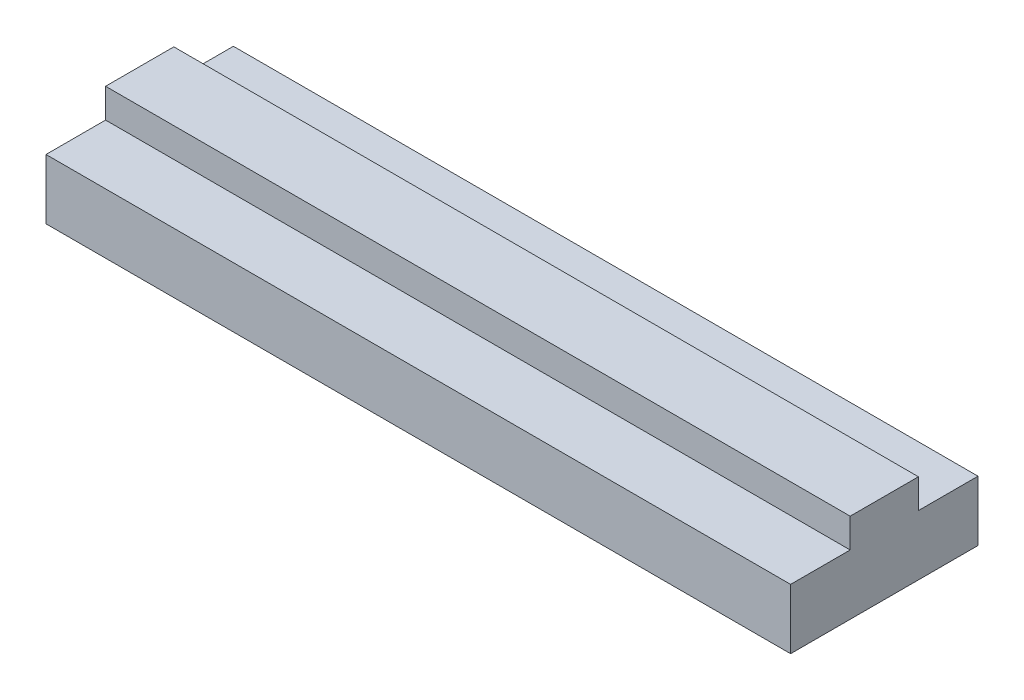
ISO-10303-21;
HEADER;
FILE_DESCRIPTION(('STEP AP214'),'2;1');
FILE_NAME('part.step','',(''),(''),'','','');
FILE_SCHEMA(('AUTOMOTIVE_DESIGN { 1 0 10303 214 1 1 1 1 }'));
ENDSEC;
DATA;
#1=APPLICATION_CONTEXT('core data for automotive mechanical design processes');
#2=APPLICATION_PROTOCOL_DEFINITION('international standard','automotive_design',2000,#1);
#3=PRODUCT_CONTEXT('',#1,'mechanical');
#4=PRODUCT('Part','Part','',(#3));
#5=PRODUCT_RELATED_PRODUCT_CATEGORY('part','',(#4));
#6=PRODUCT_DEFINITION_FORMATION('','',#4);
#7=PRODUCT_DEFINITION_CONTEXT('part definition',#1,'design');
#8=PRODUCT_DEFINITION('design','',#6,#7);
#9=PRODUCT_DEFINITION_SHAPE('','',#8);
#10=(LENGTH_UNIT() NAMED_UNIT(*) SI_UNIT(.MILLI.,.METRE.));
#11=(NAMED_UNIT(*) PLANE_ANGLE_UNIT() SI_UNIT($,.RADIAN.));
#12=(NAMED_UNIT(*) SI_UNIT($,.STERADIAN.) SOLID_ANGLE_UNIT());
#13=UNCERTAINTY_MEASURE_WITH_UNIT(LENGTH_MEASURE(1.E-05),#10,'distance_accuracy_value','');
#14=(GEOMETRIC_REPRESENTATION_CONTEXT(3) GLOBAL_UNCERTAINTY_ASSIGNED_CONTEXT((#13)) GLOBAL_UNIT_ASSIGNED_CONTEXT((#10,
#11,#12)) REPRESENTATION_CONTEXT('',''));
#15=CARTESIAN_POINT('',(0.,0.,0.));
#16=DIRECTION('',(0.,0.,1.));
#17=DIRECTION('',(1.,0.,0.));
#18=AXIS2_PLACEMENT_3D('',#15,#16,#17);
#19=CARTESIAN_POINT('',(-75.,18.,18.875));
#20=DIRECTION('',(1.,0.,0.));
#21=DIRECTION('',(0.,0.,-1.));
#22=AXIS2_PLACEMENT_3D('',#19,#20,#21);
#23=PLANE('',#22);
#24=DIRECTION('',(0.,1.,0.));
#25=VECTOR('',#24,1.);
#26=CARTESIAN_POINT('',(-75.,12.1,-6.87500000000001));
#27=LINE('',#26,#25);
#28=CARTESIAN_POINT('',(-75.,12.1,-6.87500000000001));
#29=VERTEX_POINT('',#28);
#30=CARTESIAN_POINT('',(-75.,18.,-6.87500000000001));
#31=VERTEX_POINT('',#30);
#32=EDGE_CURVE('E65',#29,#31,#27,.T.);
#33=ORIENTED_EDGE('',*,*,#32,.F.);
#34=DIRECTION('',(0.,0.,1.));
#35=VECTOR('',#34,1.);
#36=CARTESIAN_POINT('',(-75.,12.1,-6.87500000000001));
#37=LINE('',#36,#35);
#38=CARTESIAN_POINT('',(-75.,12.1,-18.875));
#39=VERTEX_POINT('',#38);
#40=EDGE_CURVE('E184',#39,#29,#37,.T.);
#41=ORIENTED_EDGE('',*,*,#40,.F.);
#42=DIRECTION('',(0.,-1.,0.));
#43=VECTOR('',#42,1.);
#44=CARTESIAN_POINT('',(-75.,18.,-18.875));
#45=LINE('',#44,#43);
#46=CARTESIAN_POINT('',(-75.,0.,-18.875));
#47=VERTEX_POINT('',#46);
#48=EDGE_CURVE('E235',#39,#47,#45,.T.);
#49=ORIENTED_EDGE('',*,*,#48,.T.);
#50=DIRECTION('',(0.,0.,1.));
#51=VECTOR('',#50,1.);
#52=CARTESIAN_POINT('',(-75.,0.,18.875));
#53=LINE('',#52,#51);
#54=CARTESIAN_POINT('',(-75.,0.,18.875));
#55=VERTEX_POINT('',#54);
#56=EDGE_CURVE('E226',#47,#55,#53,.T.);
#57=ORIENTED_EDGE('',*,*,#56,.T.);
#58=DIRECTION('',(0.,-1.,0.));
#59=VECTOR('',#58,1.);
#60=CARTESIAN_POINT('',(-75.,18.,18.875));
#61=LINE('',#60,#59);
#62=CARTESIAN_POINT('',(-75.,12.1,18.875));
#63=VERTEX_POINT('',#62);
#64=EDGE_CURVE('E11',#63,#55,#61,.T.);
#65=ORIENTED_EDGE('',*,*,#64,.F.);
#66=DIRECTION('',(0.,0.,1.));
#67=VECTOR('',#66,1.);
#68=CARTESIAN_POINT('',(-75.,12.1,6.87499999999999));
#69=LINE('',#68,#67);
#70=CARTESIAN_POINT('',(-75.,12.1,6.87499999999999));
#71=VERTEX_POINT('',#70);
#72=EDGE_CURVE('E207',#71,#63,#69,.T.);
#73=ORIENTED_EDGE('',*,*,#72,.F.);
#74=DIRECTION('',(0.,-1.,0.));
#75=VECTOR('',#74,1.);
#76=CARTESIAN_POINT('',(-75.,12.1,6.87499999999999));
#77=LINE('',#76,#75);
#78=CARTESIAN_POINT('',(-75.,18.,6.87499999999999));
#79=VERTEX_POINT('',#78);
#80=EDGE_CURVE('E204',#79,#71,#77,.T.);
#81=ORIENTED_EDGE('',*,*,#80,.F.);
#82=DIRECTION('',(0.,0.,1.));
#83=VECTOR('',#82,1.);
#84=CARTESIAN_POINT('',(-75.,18.,18.875));
#85=LINE('',#84,#83);
#86=EDGE_CURVE('E227',#31,#79,#85,.T.);
#87=ORIENTED_EDGE('',*,*,#86,.F.);
#88=EDGE_LOOP('',(#33,#41,#49,#57,#65,#73,#81,#87));
#89=FACE_BOUND('',#88,.T.);
#90=ADVANCED_FACE('F42',(#89),#23,.F.);
#91=CARTESIAN_POINT('',(75.,18.,18.875));
#92=DIRECTION('',(0.,0.,-1.));
#93=DIRECTION('',(-1.,0.,0.));
#94=AXIS2_PLACEMENT_3D('',#91,#92,#93);
#95=PLANE('',#94);
#96=DIRECTION('',(0.,-1.,0.));
#97=VECTOR('',#96,1.);
#98=CARTESIAN_POINT('',(75.,18.,18.875));
#99=LINE('',#98,#97);
#100=CARTESIAN_POINT('',(75.,12.1,18.875));
#101=VERTEX_POINT('',#100);
#102=CARTESIAN_POINT('',(75.,0.,18.875));
#103=VERTEX_POINT('',#102);
#104=EDGE_CURVE('E50',#101,#103,#99,.T.);
#105=ORIENTED_EDGE('',*,*,#104,.F.);
#106=DIRECTION('',(1.,0.,0.));
#107=VECTOR('',#106,1.);
#108=CARTESIAN_POINT('',(-88.3719856416316,12.1,18.875));
#109=LINE('',#108,#107);
#110=EDGE_CURVE('E215',#63,#101,#109,.T.);
#111=ORIENTED_EDGE('',*,*,#110,.F.);
#112=ORIENTED_EDGE('',*,*,#64,.T.);
#113=DIRECTION('',(1.,0.,0.));
#114=VECTOR('',#113,1.);
#115=CARTESIAN_POINT('',(75.,0.,18.875));
#116=LINE('',#115,#114);
#117=EDGE_CURVE('E239',#55,#103,#116,.T.);
#118=ORIENTED_EDGE('',*,*,#117,.T.);
#119=EDGE_LOOP('',(#105,#111,#112,#118));
#120=FACE_BOUND('',#119,.T.);
#121=ADVANCED_FACE('F266',(#120),#95,.F.);
#122=CARTESIAN_POINT('',(75.,18.,18.875));
#123=DIRECTION('',(-1.,0.,0.));
#124=DIRECTION('',(0.,0.,1.));
#125=AXIS2_PLACEMENT_3D('',#122,#123,#124);
#126=PLANE('',#125);
#127=DIRECTION('',(0.,-1.,0.));
#128=VECTOR('',#127,1.);
#129=CARTESIAN_POINT('',(75.,18.,-18.875));
#130=LINE('',#129,#128);
#131=CARTESIAN_POINT('',(75.,12.1,-18.875));
#132=VERTEX_POINT('',#131);
#133=CARTESIAN_POINT('',(75.,0.,-18.875));
#134=VERTEX_POINT('',#133);
#135=EDGE_CURVE('E252',#132,#134,#130,.T.);
#136=ORIENTED_EDGE('',*,*,#135,.F.);
#137=DIRECTION('',(0.,0.,-1.));
#138=VECTOR('',#137,1.);
#139=CARTESIAN_POINT('',(75.,12.1,-6.87500000000001));
#140=LINE('',#139,#138);
#141=CARTESIAN_POINT('',(75.,12.1,-6.87500000000001));
#142=VERTEX_POINT('',#141);
#143=EDGE_CURVE('E192',#142,#132,#140,.T.);
#144=ORIENTED_EDGE('',*,*,#143,.F.);
#145=DIRECTION('',(0.,-1.,0.));
#146=VECTOR('',#145,1.);
#147=CARTESIAN_POINT('',(75.,12.1,-6.87500000000001));
#148=LINE('',#147,#146);
#149=CARTESIAN_POINT('',(75.,18.,-6.87500000000001));
#150=VERTEX_POINT('',#149);
#151=EDGE_CURVE('E176',#150,#142,#148,.T.);
#152=ORIENTED_EDGE('',*,*,#151,.F.);
#153=DIRECTION('',(0.,0.,-1.));
#154=VECTOR('',#153,1.);
#155=CARTESIAN_POINT('',(75.,18.,18.875));
#156=LINE('',#155,#154);
#157=CARTESIAN_POINT('',(75.,18.,6.87499999999999));
#158=VERTEX_POINT('',#157);
#159=EDGE_CURVE('E230',#158,#150,#156,.T.);
#160=ORIENTED_EDGE('',*,*,#159,.F.);
#161=DIRECTION('',(0.,1.,0.));
#162=VECTOR('',#161,1.);
#163=CARTESIAN_POINT('',(75.,12.1,6.87499999999999));
#164=LINE('',#163,#162);
#165=CARTESIAN_POINT('',(75.,12.1,6.87499999999999));
#166=VERTEX_POINT('',#165);
#167=EDGE_CURVE('E212',#166,#158,#164,.T.);
#168=ORIENTED_EDGE('',*,*,#167,.F.);
#169=DIRECTION('',(0.,0.,-1.));
#170=VECTOR('',#169,1.);
#171=CARTESIAN_POINT('',(75.,12.1,6.87499999999999));
#172=LINE('',#171,#170);
#173=EDGE_CURVE('E188',#101,#166,#172,.T.);
#174=ORIENTED_EDGE('',*,*,#173,.F.);
#175=ORIENTED_EDGE('',*,*,#104,.T.);
#176=DIRECTION('',(0.,0.,-1.));
#177=VECTOR('',#176,1.);
#178=CARTESIAN_POINT('',(75.,0.,18.875));
#179=LINE('',#178,#177);
#180=EDGE_CURVE('E243',#103,#134,#179,.T.);
#181=ORIENTED_EDGE('',*,*,#180,.T.);
#182=EDGE_LOOP('',(#136,#144,#152,#160,#168,#174,#175,#181));
#183=FACE_BOUND('',#182,.T.);
#184=ADVANCED_FACE('F259',(#183),#126,.F.);
#185=CARTESIAN_POINT('',(75.,18.,-18.875));
#186=DIRECTION('',(0.,0.,1.));
#187=DIRECTION('',(1.,0.,0.));
#188=AXIS2_PLACEMENT_3D('',#185,#186,#187);
#189=PLANE('',#188);
#190=ORIENTED_EDGE('',*,*,#48,.F.);
#191=DIRECTION('',(1.,0.,0.));
#192=VECTOR('',#191,1.);
#193=CARTESIAN_POINT('',(-88.3719856416316,12.1,-18.875));
#194=LINE('',#193,#192);
#195=EDGE_CURVE('E185',#39,#132,#194,.T.);
#196=ORIENTED_EDGE('',*,*,#195,.T.);
#197=ORIENTED_EDGE('',*,*,#135,.T.);
#198=DIRECTION('',(-1.,0.,0.));
#199=VECTOR('',#198,1.);
#200=CARTESIAN_POINT('',(75.,0.,-18.875));
#201=LINE('',#200,#199);
#202=EDGE_CURVE('E231',#134,#47,#201,.T.);
#203=ORIENTED_EDGE('',*,*,#202,.T.);
#204=EDGE_LOOP('',(#190,#196,#197,#203));
#205=FACE_BOUND('',#204,.T.);
#206=ADVANCED_FACE('F273',(#205),#189,.F.);
#207=CARTESIAN_POINT('',(0.,18.,0.));
#208=DIRECTION('',(0.,1.,0.));
#209=DIRECTION('',(0.,0.,1.));
#210=AXIS2_PLACEMENT_3D('',#207,#208,#209);
#211=PLANE('',#210);
#212=DIRECTION('',(1.,0.,0.));
#213=VECTOR('',#212,1.);
#214=CARTESIAN_POINT('',(-88.3719856416316,18.,-6.87500000000001));
#215=LINE('',#214,#213);
#216=EDGE_CURVE('E195',#31,#150,#215,.T.);
#217=ORIENTED_EDGE('',*,*,#216,.F.);
#218=ORIENTED_EDGE('',*,*,#86,.T.);
#219=DIRECTION('',(1.,0.,0.));
#220=VECTOR('',#219,1.);
#221=CARTESIAN_POINT('',(-88.3719856416316,18.,6.87499999999999));
#222=LINE('',#221,#220);
#223=EDGE_CURVE('E208',#79,#158,#222,.T.);
#224=ORIENTED_EDGE('',*,*,#223,.T.);
#225=ORIENTED_EDGE('',*,*,#159,.T.);
#226=EDGE_LOOP('',(#217,#218,#224,#225));
#227=FACE_BOUND('',#226,.T.);
#228=ADVANCED_FACE('F283',(#227),#211,.T.);
#229=CARTESIAN_POINT('',(0.,0.,0.));
#230=DIRECTION('',(0.,1.,0.));
#231=DIRECTION('',(0.,0.,1.));
#232=AXIS2_PLACEMENT_3D('',#229,#230,#231);
#233=PLANE('',#232);
#234=DIRECTION('',(1.,0.,0.));
#235=VECTOR('',#234,1.);
#236=CARTESIAN_POINT('',(70.1,0.,-5.09999999999999));
#237=LINE('',#236,#235);
#238=CARTESIAN_POINT('',(-70.1,0.,-5.10000000000001));
#239=VERTEX_POINT('',#238);
#240=CARTESIAN_POINT('',(70.1,0.,-5.09999999999999));
#241=VERTEX_POINT('',#240);
#242=EDGE_CURVE('E167',#239,#241,#237,.T.);
#243=ORIENTED_EDGE('',*,*,#242,.F.);
#244=DIRECTION('',(0.,0.,-1.));
#245=VECTOR('',#244,1.);
#246=CARTESIAN_POINT('',(-70.1,0.,-5.10000000000001));
#247=LINE('',#246,#245);
#248=CARTESIAN_POINT('',(-70.1,0.,5.09999999999999));
#249=VERTEX_POINT('',#248);
#250=EDGE_CURVE('E57',#249,#239,#247,.T.);
#251=ORIENTED_EDGE('',*,*,#250,.F.);
#252=DIRECTION('',(-1.,0.,0.));
#253=VECTOR('',#252,1.);
#254=CARTESIAN_POINT('',(70.1,0.,5.10000000000001));
#255=LINE('',#254,#253);
#256=CARTESIAN_POINT('',(70.1,0.,5.10000000000001));
#257=VERTEX_POINT('',#256);
#258=EDGE_CURVE('E154',#257,#249,#255,.T.);
#259=ORIENTED_EDGE('',*,*,#258,.F.);
#260=DIRECTION('',(0.,0.,1.));
#261=VECTOR('',#260,1.);
#262=CARTESIAN_POINT('',(70.1,0.,-5.09999999999999));
#263=LINE('',#262,#261);
#264=EDGE_CURVE('E158',#241,#257,#263,.T.);
#265=ORIENTED_EDGE('',*,*,#264,.F.);
#266=EDGE_LOOP('',(#243,#251,#259,#265));
#267=FACE_BOUND('',#266,.T.);
#268=ORIENTED_EDGE('',*,*,#56,.F.);
#269=ORIENTED_EDGE('',*,*,#202,.F.);
#270=ORIENTED_EDGE('',*,*,#180,.F.);
#271=ORIENTED_EDGE('',*,*,#117,.F.);
#272=EDGE_LOOP('',(#268,#269,#270,#271));
#273=FACE_BOUND('',#272,.T.);
#274=ADVANCED_FACE('F270',(#267,#273),#233,.F.);
#275=CARTESIAN_POINT('',(-88.3719856416316,12.1,6.87499999999999));
#276=DIRECTION('',(0.,0.,-1.));
#277=DIRECTION('',(-1.,0.,0.));
#278=AXIS2_PLACEMENT_3D('',#275,#276,#277);
#279=PLANE('',#278);
#280=ORIENTED_EDGE('',*,*,#80,.T.);
#281=DIRECTION('',(1.,0.,0.));
#282=VECTOR('',#281,1.);
#283=CARTESIAN_POINT('',(-88.3719856416316,12.1,6.87499999999999));
#284=LINE('',#283,#282);
#285=EDGE_CURVE('E219',#71,#166,#284,.T.);
#286=ORIENTED_EDGE('',*,*,#285,.T.);
#287=ORIENTED_EDGE('',*,*,#167,.T.);
#288=ORIENTED_EDGE('',*,*,#223,.F.);
#289=EDGE_LOOP('',(#280,#286,#287,#288));
#290=FACE_BOUND('',#289,.T.);
#291=ADVANCED_FACE('F290',(#290),#279,.F.);
#292=CARTESIAN_POINT('',(-88.3719856416316,12.1,6.87499999999999));
#293=DIRECTION('',(0.,-1.,0.));
#294=DIRECTION('',(0.,0.,-1.));
#295=AXIS2_PLACEMENT_3D('',#292,#293,#294);
#296=PLANE('',#295);
#297=ORIENTED_EDGE('',*,*,#72,.T.);
#298=ORIENTED_EDGE('',*,*,#110,.T.);
#299=ORIENTED_EDGE('',*,*,#173,.T.);
#300=ORIENTED_EDGE('',*,*,#285,.F.);
#301=EDGE_LOOP('',(#297,#298,#299,#300));
#302=FACE_BOUND('',#301,.T.);
#303=ADVANCED_FACE('F292',(#302),#296,.F.);
#304=CARTESIAN_POINT('',(-88.3719856416316,12.1,-6.87500000000001));
#305=DIRECTION('',(0.,-1.,0.));
#306=DIRECTION('',(0.,0.,-1.));
#307=AXIS2_PLACEMENT_3D('',#304,#305,#306);
#308=PLANE('',#307);
#309=ORIENTED_EDGE('',*,*,#40,.T.);
#310=DIRECTION('',(1.,0.,0.));
#311=VECTOR('',#310,1.);
#312=CARTESIAN_POINT('',(-88.3719856416316,12.1,-6.87500000000001));
#313=LINE('',#312,#311);
#314=EDGE_CURVE('E199',#29,#142,#313,.T.);
#315=ORIENTED_EDGE('',*,*,#314,.T.);
#316=ORIENTED_EDGE('',*,*,#143,.T.);
#317=ORIENTED_EDGE('',*,*,#195,.F.);
#318=EDGE_LOOP('',(#309,#315,#316,#317));
#319=FACE_BOUND('',#318,.T.);
#320=ADVANCED_FACE('F278',(#319),#308,.F.);
#321=CARTESIAN_POINT('',(-88.3719856416316,12.1,-6.87500000000001));
#322=DIRECTION('',(0.,0.,1.));
#323=DIRECTION('',(1.,0.,0.));
#324=AXIS2_PLACEMENT_3D('',#321,#322,#323);
#325=PLANE('',#324);
#326=ORIENTED_EDGE('',*,*,#32,.T.);
#327=ORIENTED_EDGE('',*,*,#216,.T.);
#328=ORIENTED_EDGE('',*,*,#151,.T.);
#329=ORIENTED_EDGE('',*,*,#314,.F.);
#330=EDGE_LOOP('',(#326,#327,#328,#329));
#331=FACE_BOUND('',#330,.T.);
#332=ADVANCED_FACE('F280',(#331),#325,.F.);
#333=CARTESIAN_POINT('',(-70.1,7.5,-5.10000000000001));
#334=DIRECTION('',(-1.,0.,0.));
#335=DIRECTION('',(0.,0.,1.));
#336=AXIS2_PLACEMENT_3D('',#333,#334,#335);
#337=PLANE('',#336);
#338=ORIENTED_EDGE('',*,*,#250,.T.);
#339=DIRECTION('',(0.,-1.,0.));
#340=VECTOR('',#339,1.);
#341=CARTESIAN_POINT('',(-70.1,7.5,-5.10000000000001));
#342=LINE('',#341,#340);
#343=CARTESIAN_POINT('',(-70.1,7.5,-5.10000000000001));
#344=VERTEX_POINT('',#343);
#345=EDGE_CURVE('E129',#344,#239,#342,.T.);
#346=ORIENTED_EDGE('',*,*,#345,.F.);
#347=DIRECTION('',(0.,0.,-1.));
#348=VECTOR('',#347,1.);
#349=CARTESIAN_POINT('',(-70.1,7.5,-5.10000000000001));
#350=LINE('',#349,#348);
#351=CARTESIAN_POINT('',(-70.1,7.5,5.09999999999999));
#352=VERTEX_POINT('',#351);
#353=EDGE_CURVE('E133',#352,#344,#350,.T.);
#354=ORIENTED_EDGE('',*,*,#353,.F.);
#355=DIRECTION('',(0.,-1.,0.));
#356=VECTOR('',#355,1.);
#357=CARTESIAN_POINT('',(-70.1,7.5,5.09999999999999));
#358=LINE('',#357,#356);
#359=EDGE_CURVE('E173',#352,#249,#358,.T.);
#360=ORIENTED_EDGE('',*,*,#359,.T.);
#361=EDGE_LOOP('',(#338,#346,#354,#360));
#362=FACE_BOUND('',#361,.T.);
#363=ADVANCED_FACE('F131',(#362),#337,.F.);
#364=CARTESIAN_POINT('',(70.1,7.5,5.10000000000001));
#365=DIRECTION('',(0.,0.,1.));
#366=DIRECTION('',(1.,0.,0.));
#367=AXIS2_PLACEMENT_3D('',#364,#365,#366);
#368=PLANE('',#367);
#369=ORIENTED_EDGE('',*,*,#258,.T.);
#370=ORIENTED_EDGE('',*,*,#359,.F.);
#371=DIRECTION('',(-1.,0.,0.));
#372=VECTOR('',#371,1.);
#373=CARTESIAN_POINT('',(70.1,7.5,5.10000000000001));
#374=LINE('',#373,#372);
#375=CARTESIAN_POINT('',(70.1,7.5,5.10000000000001));
#376=VERTEX_POINT('',#375);
#377=EDGE_CURVE('E140',#376,#352,#374,.T.);
#378=ORIENTED_EDGE('',*,*,#377,.F.);
#379=DIRECTION('',(0.,-1.,0.));
#380=VECTOR('',#379,1.);
#381=CARTESIAN_POINT('',(70.1,7.5,5.10000000000001));
#382=LINE('',#381,#380);
#383=EDGE_CURVE('E177',#376,#257,#382,.T.);
#384=ORIENTED_EDGE('',*,*,#383,.T.);
#385=EDGE_LOOP('',(#369,#370,#378,#384));
#386=FACE_BOUND('',#385,.T.);
#387=ADVANCED_FACE('F388',(#386),#368,.F.);
#388=CARTESIAN_POINT('',(70.1,7.5,-5.09999999999999));
#389=DIRECTION('',(1.,0.,0.));
#390=DIRECTION('',(0.,0.,-1.));
#391=AXIS2_PLACEMENT_3D('',#388,#389,#390);
#392=PLANE('',#391);
#393=ORIENTED_EDGE('',*,*,#264,.T.);
#394=ORIENTED_EDGE('',*,*,#383,.F.);
#395=DIRECTION('',(0.,0.,1.));
#396=VECTOR('',#395,1.);
#397=CARTESIAN_POINT('',(70.1,7.5,-5.09999999999999));
#398=LINE('',#397,#396);
#399=CARTESIAN_POINT('',(70.1,7.5,-5.09999999999999));
#400=VERTEX_POINT('',#399);
#401=EDGE_CURVE('E149',#400,#376,#398,.T.);
#402=ORIENTED_EDGE('',*,*,#401,.F.);
#403=DIRECTION('',(0.,-1.,0.));
#404=VECTOR('',#403,1.);
#405=CARTESIAN_POINT('',(70.1,7.5,-5.09999999999999));
#406=LINE('',#405,#404);
#407=EDGE_CURVE('E139',#400,#241,#406,.T.);
#408=ORIENTED_EDGE('',*,*,#407,.T.);
#409=EDGE_LOOP('',(#393,#394,#402,#408));
#410=FACE_BOUND('',#409,.T.);
#411=ADVANCED_FACE('F396',(#410),#392,.F.);
#412=CARTESIAN_POINT('',(70.1,7.5,-5.09999999999999));
#413=DIRECTION('',(0.,0.,-1.));
#414=DIRECTION('',(-1.,0.,0.));
#415=AXIS2_PLACEMENT_3D('',#412,#413,#414);
#416=PLANE('',#415);
#417=ORIENTED_EDGE('',*,*,#242,.T.);
#418=ORIENTED_EDGE('',*,*,#407,.F.);
#419=DIRECTION('',(1.,0.,0.));
#420=VECTOR('',#419,1.);
#421=CARTESIAN_POINT('',(70.1,7.5,-5.09999999999999));
#422=LINE('',#421,#420);
#423=EDGE_CURVE('E143',#344,#400,#422,.T.);
#424=ORIENTED_EDGE('',*,*,#423,.F.);
#425=ORIENTED_EDGE('',*,*,#345,.T.);
#426=EDGE_LOOP('',(#417,#418,#424,#425));
#427=FACE_BOUND('',#426,.T.);
#428=ADVANCED_FACE('F144',(#427),#416,.F.);
#429=CARTESIAN_POINT('',(0.,7.5,0.));
#430=DIRECTION('',(0.,-1.,0.));
#431=DIRECTION('',(0.,0.,-1.));
#432=AXIS2_PLACEMENT_3D('',#429,#430,#431);
#433=PLANE('',#432);
#434=ORIENTED_EDGE('',*,*,#353,.T.);
#435=ORIENTED_EDGE('',*,*,#423,.T.);
#436=ORIENTED_EDGE('',*,*,#401,.T.);
#437=ORIENTED_EDGE('',*,*,#377,.T.);
#438=EDGE_LOOP('',(#434,#435,#436,#437));
#439=FACE_BOUND('',#438,.T.);
#440=ADVANCED_FACE('F151',(#439),#433,.T.);
#441=CLOSED_SHELL('',(#90,#121,#184,#206,#228,#274,#291,#303,#320,#332,#363,#387,#411,#428,#440));
#442=MANIFOLD_SOLID_BREP('B2',#441);
#443=ADVANCED_BREP_SHAPE_REPRESENTATION('',(#18,#442),#14);
#444=SHAPE_DEFINITION_REPRESENTATION(#9,#443);
ENDSEC;
END-ISO-10303-21;
